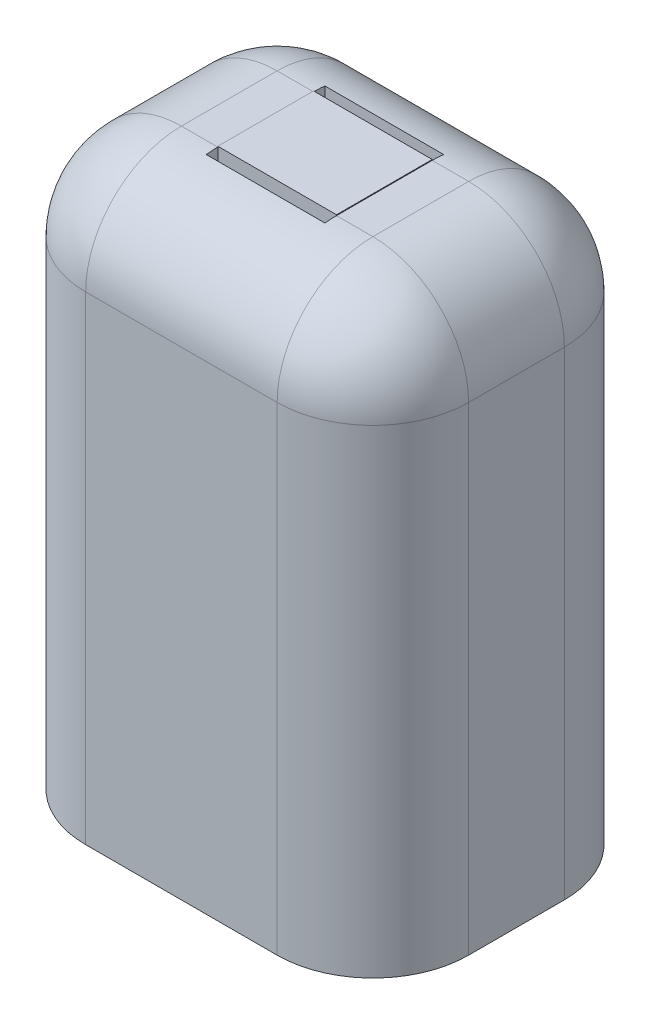
ISO-10303-21;
HEADER;
FILE_DESCRIPTION(('STEP AP214'),'2;1');
FILE_NAME('part.step','',(''),(''),'','','');
FILE_SCHEMA(('AUTOMOTIVE_DESIGN { 1 0 10303 214 1 1 1 1 }'));
ENDSEC;
DATA;
#1=APPLICATION_CONTEXT('core data for automotive mechanical design processes');
#2=APPLICATION_PROTOCOL_DEFINITION('international standard','automotive_design',2000,#1);
#3=PRODUCT_CONTEXT('',#1,'mechanical');
#4=PRODUCT('Part','Part','',(#3));
#5=PRODUCT_RELATED_PRODUCT_CATEGORY('part','',(#4));
#6=PRODUCT_DEFINITION_FORMATION('','',#4);
#7=PRODUCT_DEFINITION_CONTEXT('part definition',#1,'design');
#8=PRODUCT_DEFINITION('design','',#6,#7);
#9=PRODUCT_DEFINITION_SHAPE('','',#8);
#10=(LENGTH_UNIT() NAMED_UNIT(*) SI_UNIT(.MILLI.,.METRE.));
#11=(NAMED_UNIT(*) PLANE_ANGLE_UNIT() SI_UNIT($,.RADIAN.));
#12=(NAMED_UNIT(*) SI_UNIT($,.STERADIAN.) SOLID_ANGLE_UNIT());
#13=UNCERTAINTY_MEASURE_WITH_UNIT(LENGTH_MEASURE(1.E-05),#10,'distance_accuracy_value','');
#14=(GEOMETRIC_REPRESENTATION_CONTEXT(3) GLOBAL_UNCERTAINTY_ASSIGNED_CONTEXT((#13)) GLOBAL_UNIT_ASSIGNED_CONTEXT((#10,
#11,#12)) REPRESENTATION_CONTEXT('',''));
#15=CARTESIAN_POINT('',(0.,0.,0.));
#16=DIRECTION('',(0.,0.,1.));
#17=DIRECTION('',(1.,0.,0.));
#18=AXIS2_PLACEMENT_3D('',#15,#16,#17);
#19=CARTESIAN_POINT('',(-33.1654955272789,108.658164147272,4.4));
#20=DIRECTION('',(1.,0.,0.));
#21=DIRECTION('',(0.,0.,-1.));
#22=AXIS2_PLACEMENT_3D('',#19,#20,#21);
#23=PLANE('',#22);
#24=DIRECTION('',(0.,-1.,0.));
#25=VECTOR('',#24,1.);
#26=CARTESIAN_POINT('',(-33.1654955272789,135.449726458498,10.));
#27=LINE('',#26,#25);
#28=CARTESIAN_POINT('',(-33.1654955272789,135.408164147272,10.));
#29=VERTEX_POINT('',#28);
#30=CARTESIAN_POINT('',(-33.1654955272789,134.449726458498,10.));
#31=VERTEX_POINT('',#30);
#32=EDGE_CURVE('E50',#29,#31,#27,.T.);
#33=ORIENTED_EDGE('',*,*,#32,.T.);
#34=DIRECTION('',(0.,0.,-1.));
#35=VECTOR('',#34,1.);
#36=CARTESIAN_POINT('',(-33.1654955272789,134.449726458498,10.));
#37=LINE('',#36,#35);
#38=CARTESIAN_POINT('',(-33.1654955272789,134.449726458498,5.));
#39=VERTEX_POINT('',#38);
#40=EDGE_CURVE('E169',#31,#39,#37,.T.);
#41=ORIENTED_EDGE('',*,*,#40,.T.);
#42=DIRECTION('',(0.,1.,0.));
#43=VECTOR('',#42,1.);
#44=CARTESIAN_POINT('',(-33.1654955272789,135.449726458498,5.));
#45=LINE('',#44,#43);
#46=CARTESIAN_POINT('',(-33.1654955272789,135.408164147272,5.));
#47=VERTEX_POINT('',#46);
#48=EDGE_CURVE('E173',#39,#47,#45,.T.);
#49=ORIENTED_EDGE('',*,*,#48,.T.);
#50=CARTESIAN_POINT('',(-33.1654955272789,130.408164147272,5.));
#51=DIRECTION('',(1.,0.,0.));
#52=DIRECTION('',(0.,0.,-1.));
#53=AXIS2_PLACEMENT_3D('',#50,#51,#52);
#54=CIRCLE('',#53,5.);
#55=CARTESIAN_POINT('',(-33.1654955272789,135.372033605669,4.4));
#56=VERTEX_POINT('',#55);
#57=EDGE_CURVE('E339',#47,#56,#54,.F.);
#58=ORIENTED_EDGE('',*,*,#57,.T.);
#59=DIRECTION('',(0.,-1.,0.));
#60=VECTOR('',#59,1.);
#61=CARTESIAN_POINT('',(-33.1654955272789,108.658164147272,4.4));
#62=LINE('',#61,#60);
#63=CARTESIAN_POINT('',(-33.1654955272789,105.408164147272,4.4));
#64=VERTEX_POINT('',#63);
#65=EDGE_CURVE('E238',#56,#64,#62,.T.);
#66=ORIENTED_EDGE('',*,*,#65,.T.);
#67=DIRECTION('',(0.,0.,1.));
#68=VECTOR('',#67,1.);
#69=CARTESIAN_POINT('',(-33.1654955272789,105.408164147272,4.4));
#70=LINE('',#69,#68);
#71=CARTESIAN_POINT('',(-33.1654955272789,105.408164147272,10.6));
#72=VERTEX_POINT('',#71);
#73=EDGE_CURVE('E225',#64,#72,#70,.T.);
#74=ORIENTED_EDGE('',*,*,#73,.T.);
#75=DIRECTION('',(0.,-1.,0.));
#76=VECTOR('',#75,1.);
#77=CARTESIAN_POINT('',(-33.1654955272789,108.658164147272,10.6));
#78=LINE('',#77,#76);
#79=CARTESIAN_POINT('',(-33.1654955272789,135.372033605669,10.6));
#80=VERTEX_POINT('',#79);
#81=EDGE_CURVE('E237',#80,#72,#78,.T.);
#82=ORIENTED_EDGE('',*,*,#81,.F.);
#83=CARTESIAN_POINT('',(-33.1654955272789,130.408164147272,10.));
#84=DIRECTION('',(1.,0.,0.));
#85=DIRECTION('',(0.,0.,-1.));
#86=AXIS2_PLACEMENT_3D('',#83,#84,#85);
#87=CIRCLE('',#86,5.);
#88=EDGE_CURVE('E216',#80,#29,#87,.F.);
#89=ORIENTED_EDGE('',*,*,#88,.T.);
#90=EDGE_LOOP('',(#33,#41,#49,#58,#66,#74,#82,#89));
#91=FACE_BOUND('',#90,.T.);
#92=ADVANCED_FACE('F35',(#91),#23,.F.);
#93=CARTESIAN_POINT('',(-39.3654955272789,108.658164147272,4.4));
#94=DIRECTION('',(-1.,0.,0.));
#95=DIRECTION('',(0.,0.,1.));
#96=AXIS2_PLACEMENT_3D('',#93,#94,#95);
#97=PLANE('',#96);
#98=DIRECTION('',(0.,-1.,0.));
#99=VECTOR('',#98,1.);
#100=CARTESIAN_POINT('',(-39.3654955272789,135.449726458498,10.));
#101=LINE('',#100,#99);
#102=CARTESIAN_POINT('',(-39.3654955272789,135.408164147272,10.));
#103=VERTEX_POINT('',#102);
#104=CARTESIAN_POINT('',(-39.3654955272789,134.449726458498,10.));
#105=VERTEX_POINT('',#104);
#106=EDGE_CURVE('E201',#103,#105,#101,.T.);
#107=ORIENTED_EDGE('',*,*,#106,.F.);
#108=CARTESIAN_POINT('',(-39.3654955272789,130.408164147272,10.));
#109=DIRECTION('',(-1.,0.,0.));
#110=DIRECTION('',(0.,0.,1.));
#111=AXIS2_PLACEMENT_3D('',#108,#109,#110);
#112=CIRCLE('',#111,5.);
#113=CARTESIAN_POINT('',(-39.3654955272789,135.372033605669,10.6));
#114=VERTEX_POINT('',#113);
#115=EDGE_CURVE('E221',#103,#114,#112,.F.);
#116=ORIENTED_EDGE('',*,*,#115,.T.);
#117=DIRECTION('',(0.,-1.,0.));
#118=VECTOR('',#117,1.);
#119=CARTESIAN_POINT('',(-39.3654955272789,108.658164147272,10.6));
#120=LINE('',#119,#118);
#121=CARTESIAN_POINT('',(-39.3654955272789,105.408164147272,10.6));
#122=VERTEX_POINT('',#121);
#123=EDGE_CURVE('E243',#114,#122,#120,.T.);
#124=ORIENTED_EDGE('',*,*,#123,.T.);
#125=DIRECTION('',(0.,0.,-1.));
#126=VECTOR('',#125,1.);
#127=CARTESIAN_POINT('',(-39.3654955272789,105.408164147272,4.4));
#128=LINE('',#127,#126);
#129=CARTESIAN_POINT('',(-39.3654955272789,105.408164147272,4.4));
#130=VERTEX_POINT('',#129);
#131=EDGE_CURVE('E231',#122,#130,#128,.T.);
#132=ORIENTED_EDGE('',*,*,#131,.T.);
#133=DIRECTION('',(0.,-1.,0.));
#134=VECTOR('',#133,1.);
#135=CARTESIAN_POINT('',(-39.3654955272789,108.658164147272,4.4));
#136=LINE('',#135,#134);
#137=CARTESIAN_POINT('',(-39.3654955272789,135.372033605669,4.4));
#138=VERTEX_POINT('',#137);
#139=EDGE_CURVE('E241',#138,#130,#136,.T.);
#140=ORIENTED_EDGE('',*,*,#139,.F.);
#141=CARTESIAN_POINT('',(-39.3654955272789,130.408164147272,5.));
#142=DIRECTION('',(-1.,0.,0.));
#143=DIRECTION('',(0.,0.,1.));
#144=AXIS2_PLACEMENT_3D('',#141,#142,#143);
#145=CIRCLE('',#144,5.);
#146=CARTESIAN_POINT('',(-39.3654955272789,135.408164147272,5.));
#147=VERTEX_POINT('',#146);
#148=EDGE_CURVE('E43',#138,#147,#145,.F.);
#149=ORIENTED_EDGE('',*,*,#148,.T.);
#150=DIRECTION('',(0.,1.,0.));
#151=VECTOR('',#150,1.);
#152=CARTESIAN_POINT('',(-39.3654955272789,135.449726458498,5.));
#153=LINE('',#152,#151);
#154=CARTESIAN_POINT('',(-39.3654955272789,134.449726458498,5.));
#155=VERTEX_POINT('',#154);
#156=EDGE_CURVE('E204',#155,#147,#153,.T.);
#157=ORIENTED_EDGE('',*,*,#156,.F.);
#158=DIRECTION('',(0.,0.,-1.));
#159=VECTOR('',#158,1.);
#160=CARTESIAN_POINT('',(-39.3654955272789,134.449726458498,10.));
#161=LINE('',#160,#159);
#162=EDGE_CURVE('E58',#105,#155,#161,.T.);
#163=ORIENTED_EDGE('',*,*,#162,.F.);
#164=EDGE_LOOP('',(#107,#116,#124,#132,#140,#149,#157,#163));
#165=FACE_BOUND('',#164,.T.);
#166=ADVANCED_FACE('F343',(#165),#97,.F.);
#167=CARTESIAN_POINT('',(-46.2654955272789,135.408164147272,15.));
#168=DIRECTION('',(0.,-1.,0.));
#169=DIRECTION('',(0.,0.,-1.));
#170=AXIS2_PLACEMENT_3D('',#167,#168,#169);
#171=PLANE('',#170);
#172=DIRECTION('',(-1.,0.,0.));
#173=VECTOR('',#172,1.);
#174=CARTESIAN_POINT('',(-26.2654955272789,135.408164147272,10.));
#175=LINE('',#174,#173);
#176=CARTESIAN_POINT('',(-41.2654955272789,135.408164147272,10.));
#177=VERTEX_POINT('',#176);
#178=EDGE_CURVE('E265',#177,#103,#175,.F.);
#179=ORIENTED_EDGE('',*,*,#178,.T.);
#180=DIRECTION('',(0.,0.,-1.));
#181=VECTOR('',#180,1.);
#182=CARTESIAN_POINT('',(-39.3654955272789,135.408164147272,15.));
#183=LINE('',#182,#181);
#184=EDGE_CURVE('E218',#103,#147,#183,.T.);
#185=ORIENTED_EDGE('',*,*,#184,.T.);
#186=DIRECTION('',(-1.,0.,0.));
#187=VECTOR('',#186,1.);
#188=CARTESIAN_POINT('',(-46.2654955272789,135.408164147272,5.));
#189=LINE('',#188,#187);
#190=CARTESIAN_POINT('',(-41.2654955272789,135.408164147272,5.));
#191=VERTEX_POINT('',#190);
#192=EDGE_CURVE('E258',#147,#191,#189,.T.);
#193=ORIENTED_EDGE('',*,*,#192,.T.);
#194=DIRECTION('',(0.,0.,-1.));
#195=VECTOR('',#194,1.);
#196=CARTESIAN_POINT('',(-41.2654955272789,135.408164147272,15.));
#197=LINE('',#196,#195);
#198=EDGE_CURVE('E262',#191,#177,#197,.F.);
#199=ORIENTED_EDGE('',*,*,#198,.T.);
#200=EDGE_LOOP('',(#179,#185,#193,#199));
#201=FACE_BOUND('',#200,.T.);
#202=ADVANCED_FACE('F376',(#201),#171,.F.);
#203=CARTESIAN_POINT('',(-26.2654955272789,135.408164147272,15.));
#204=DIRECTION('',(-1.,0.,0.));
#205=DIRECTION('',(0.,-1.,0.));
#206=AXIS2_PLACEMENT_3D('',#203,#204,#205);
#207=PLANE('',#206);
#208=DIRECTION('',(0.,0.,-1.));
#209=VECTOR('',#208,1.);
#210=CARTESIAN_POINT('',(-26.2654955272789,105.408164147272,15.));
#211=LINE('',#210,#209);
#212=CARTESIAN_POINT('',(-26.2654955272789,105.408164147272,10.));
#213=VERTEX_POINT('',#212);
#214=CARTESIAN_POINT('',(-26.2654955272789,105.408164147272,5.));
#215=VERTEX_POINT('',#214);
#216=EDGE_CURVE('E250',#213,#215,#211,.T.);
#217=ORIENTED_EDGE('',*,*,#216,.T.);
#218=DIRECTION('',(0.,1.,0.));
#219=VECTOR('',#218,1.);
#220=CARTESIAN_POINT('',(-26.2654955272789,135.408164147272,5.));
#221=LINE('',#220,#219);
#222=CARTESIAN_POINT('',(-26.2654955272789,130.408164147272,5.));
#223=VERTEX_POINT('',#222);
#224=EDGE_CURVE('E276',#215,#223,#221,.T.);
#225=ORIENTED_EDGE('',*,*,#224,.T.);
#226=DIRECTION('',(0.,0.,-1.));
#227=VECTOR('',#226,1.);
#228=CARTESIAN_POINT('',(-26.2654955272789,130.408164147272,15.));
#229=LINE('',#228,#227);
#230=CARTESIAN_POINT('',(-26.2654955272789,130.408164147272,10.));
#231=VERTEX_POINT('',#230);
#232=EDGE_CURVE('E273',#223,#231,#229,.F.);
#233=ORIENTED_EDGE('',*,*,#232,.T.);
#234=DIRECTION('',(0.,1.,0.));
#235=VECTOR('',#234,1.);
#236=CARTESIAN_POINT('',(-26.2654955272789,105.408164147272,10.));
#237=LINE('',#236,#235);
#238=EDGE_CURVE('E271',#231,#213,#237,.F.);
#239=ORIENTED_EDGE('',*,*,#238,.T.);
#240=EDGE_LOOP('',(#217,#225,#233,#239));
#241=FACE_BOUND('',#240,.T.);
#242=ADVANCED_FACE('F449',(#241),#207,.F.);
#243=CARTESIAN_POINT('',(-31.2654955272789,135.408164147272,5.));
#244=VERTEX_POINT('',#243);
#245=EDGE_CURVE('E259',#244,#47,#189,.T.);
#246=ORIENTED_EDGE('',*,*,#245,.T.);
#247=DIRECTION('',(0.,0.,1.));
#248=VECTOR('',#247,1.);
#249=CARTESIAN_POINT('',(-33.1654955272789,135.408164147272,15.));
#250=LINE('',#249,#248);
#251=EDGE_CURVE('E213',#47,#29,#250,.T.);
#252=ORIENTED_EDGE('',*,*,#251,.T.);
#253=CARTESIAN_POINT('',(-31.2654955272789,135.408164147272,10.));
#254=VERTEX_POINT('',#253);
#255=EDGE_CURVE('E264',#29,#254,#175,.F.);
#256=ORIENTED_EDGE('',*,*,#255,.T.);
#257=DIRECTION('',(0.,0.,-1.));
#258=VECTOR('',#257,1.);
#259=CARTESIAN_POINT('',(-31.2654955272789,135.408164147272,15.));
#260=LINE('',#259,#258);
#261=EDGE_CURVE('E268',#254,#244,#260,.T.);
#262=ORIENTED_EDGE('',*,*,#261,.T.);
#263=EDGE_LOOP('',(#246,#252,#256,#262));
#264=FACE_BOUND('',#263,.T.);
#265=ADVANCED_FACE('F362',(#264),#171,.F.);
#266=CARTESIAN_POINT('',(-46.2654955272789,135.408164147272,15.));
#267=DIRECTION('',(1.,0.,0.));
#268=DIRECTION('',(0.,0.,-1.));
#269=AXIS2_PLACEMENT_3D('',#266,#267,#268);
#270=PLANE('',#269);
#271=DIRECTION('',(0.,0.,-1.));
#272=VECTOR('',#271,1.);
#273=CARTESIAN_POINT('',(-46.2654955272789,130.408164147272,15.));
#274=LINE('',#273,#272);
#275=CARTESIAN_POINT('',(-46.2654955272789,130.408164147272,10.));
#276=VERTEX_POINT('',#275);
#277=CARTESIAN_POINT('',(-46.2654955272789,130.408164147272,5.));
#278=VERTEX_POINT('',#277);
#279=EDGE_CURVE('E286',#276,#278,#274,.T.);
#280=ORIENTED_EDGE('',*,*,#279,.T.);
#281=DIRECTION('',(0.,-1.,0.));
#282=VECTOR('',#281,1.);
#283=CARTESIAN_POINT('',(-46.2654955272789,135.408164147272,5.));
#284=LINE('',#283,#282);
#285=CARTESIAN_POINT('',(-46.2654955272789,105.408164147272,5.));
#286=VERTEX_POINT('',#285);
#287=EDGE_CURVE('E288',#278,#286,#284,.T.);
#288=ORIENTED_EDGE('',*,*,#287,.T.);
#289=DIRECTION('',(0.,0.,-1.));
#290=VECTOR('',#289,1.);
#291=CARTESIAN_POINT('',(-46.2654955272789,105.408164147272,15.));
#292=LINE('',#291,#290);
#293=CARTESIAN_POINT('',(-46.2654955272789,105.408164147272,10.));
#294=VERTEX_POINT('',#293);
#295=EDGE_CURVE('E255',#294,#286,#292,.T.);
#296=ORIENTED_EDGE('',*,*,#295,.F.);
#297=DIRECTION('',(0.,-1.,0.));
#298=VECTOR('',#297,1.);
#299=CARTESIAN_POINT('',(-46.2654955272789,135.408164147272,10.));
#300=LINE('',#299,#298);
#301=EDGE_CURVE('E284',#294,#276,#300,.F.);
#302=ORIENTED_EDGE('',*,*,#301,.T.);
#303=EDGE_LOOP('',(#280,#288,#296,#302));
#304=FACE_BOUND('',#303,.T.);
#305=ADVANCED_FACE('F443',(#304),#270,.F.);
#306=CARTESIAN_POINT('',(-46.2654955272789,105.408164147272,15.));
#307=DIRECTION('',(0.,1.,0.));
#308=DIRECTION('',(0.,0.,1.));
#309=AXIS2_PLACEMENT_3D('',#306,#307,#308);
#310=PLANE('',#309);
#311=DIRECTION('',(-1.,0.,0.));
#312=VECTOR('',#311,1.);
#313=CARTESIAN_POINT('',(-39.3654955272789,105.408164147272,10.6));
#314=LINE('',#313,#312);
#315=EDGE_CURVE('E227',#72,#122,#314,.T.);
#316=ORIENTED_EDGE('',*,*,#315,.F.);
#317=ORIENTED_EDGE('',*,*,#73,.F.);
#318=DIRECTION('',(1.,0.,0.));
#319=VECTOR('',#318,1.);
#320=CARTESIAN_POINT('',(-39.3654955272789,105.408164147272,4.4));
#321=LINE('',#320,#319);
#322=EDGE_CURVE('E234',#130,#64,#321,.T.);
#323=ORIENTED_EDGE('',*,*,#322,.F.);
#324=ORIENTED_EDGE('',*,*,#131,.F.);
#325=EDGE_LOOP('',(#316,#317,#323,#324));
#326=FACE_BOUND('',#325,.T.);
#327=ORIENTED_EDGE('',*,*,#295,.T.);
#328=CARTESIAN_POINT('',(-41.2654955272789,105.408164147272,5.));
#329=DIRECTION('',(0.,1.,0.));
#330=DIRECTION('',(0.,0.,1.));
#331=AXIS2_PLACEMENT_3D('',#328,#329,#330);
#332=CIRCLE('',#331,5.);
#333=CARTESIAN_POINT('',(-41.2654955272789,105.408164147272,0.));
#334=VERTEX_POINT('',#333);
#335=EDGE_CURVE('E302',#286,#334,#332,.F.);
#336=ORIENTED_EDGE('',*,*,#335,.T.);
#337=DIRECTION('',(1.,0.,0.));
#338=VECTOR('',#337,1.);
#339=CARTESIAN_POINT('',(-46.2654955272789,105.408164147272,0.));
#340=LINE('',#339,#338);
#341=CARTESIAN_POINT('',(-31.2654955272789,105.408164147272,0.));
#342=VERTEX_POINT('',#341);
#343=EDGE_CURVE('E240',#334,#342,#340,.T.);
#344=ORIENTED_EDGE('',*,*,#343,.T.);
#345=CARTESIAN_POINT('',(-31.2654955272789,105.408164147272,5.));
#346=DIRECTION('',(0.,1.,0.));
#347=DIRECTION('',(0.,0.,1.));
#348=AXIS2_PLACEMENT_3D('',#345,#346,#347);
#349=CIRCLE('',#348,5.);
#350=EDGE_CURVE('E298',#342,#215,#349,.F.);
#351=ORIENTED_EDGE('',*,*,#350,.T.);
#352=ORIENTED_EDGE('',*,*,#216,.F.);
#353=CARTESIAN_POINT('',(-31.2654955272789,105.408164147272,10.));
#354=DIRECTION('',(0.,1.,0.));
#355=DIRECTION('',(0.,0.,1.));
#356=AXIS2_PLACEMENT_3D('',#353,#354,#355);
#357=CIRCLE('',#356,5.);
#358=CARTESIAN_POINT('',(-31.2654955272789,105.408164147272,15.));
#359=VERTEX_POINT('',#358);
#360=EDGE_CURVE('E296',#213,#359,#357,.F.);
#361=ORIENTED_EDGE('',*,*,#360,.T.);
#362=DIRECTION('',(1.,0.,0.));
#363=VECTOR('',#362,1.);
#364=CARTESIAN_POINT('',(-46.2654955272789,105.408164147272,15.));
#365=LINE('',#364,#363);
#366=CARTESIAN_POINT('',(-41.2654955272789,105.408164147272,15.));
#367=VERTEX_POINT('',#366);
#368=EDGE_CURVE('E247',#367,#359,#365,.T.);
#369=ORIENTED_EDGE('',*,*,#368,.F.);
#370=CARTESIAN_POINT('',(-41.2654955272789,105.408164147272,10.));
#371=DIRECTION('',(0.,1.,0.));
#372=DIRECTION('',(0.,0.,1.));
#373=AXIS2_PLACEMENT_3D('',#370,#371,#372);
#374=CIRCLE('',#373,5.);
#375=EDGE_CURVE('E300',#367,#294,#374,.F.);
#376=ORIENTED_EDGE('',*,*,#375,.T.);
#377=EDGE_LOOP('',(#327,#336,#344,#351,#352,#361,#369,#376));
#378=FACE_BOUND('',#377,.T.);
#379=ADVANCED_FACE('F415',(#326,#378),#310,.F.);
#380=CARTESIAN_POINT('',(0.,0.,15.));
#381=DIRECTION('',(0.,0.,1.));
#382=DIRECTION('',(1.,0.,0.));
#383=AXIS2_PLACEMENT_3D('',#380,#381,#382);
#384=PLANE('',#383);
#385=DIRECTION('',(-1.,0.,0.));
#386=VECTOR('',#385,1.);
#387=CARTESIAN_POINT('',(-46.2654955272789,130.408164147272,15.));
#388=LINE('',#387,#386);
#389=CARTESIAN_POINT('',(-31.2654955272789,130.408164147272,15.));
#390=VERTEX_POINT('',#389);
#391=CARTESIAN_POINT('',(-41.2654955272789,130.408164147272,15.));
#392=VERTEX_POINT('',#391);
#393=EDGE_CURVE('E280',#390,#392,#388,.T.);
#394=ORIENTED_EDGE('',*,*,#393,.T.);
#395=DIRECTION('',(0.,-1.,0.));
#396=VECTOR('',#395,1.);
#397=CARTESIAN_POINT('',(-41.2654955272789,105.408164147272,15.));
#398=LINE('',#397,#396);
#399=EDGE_CURVE('E282',#392,#367,#398,.T.);
#400=ORIENTED_EDGE('',*,*,#399,.T.);
#401=ORIENTED_EDGE('',*,*,#368,.T.);
#402=DIRECTION('',(0.,1.,0.));
#403=VECTOR('',#402,1.);
#404=CARTESIAN_POINT('',(-31.2654955272789,135.408164147272,15.));
#405=LINE('',#404,#403);
#406=EDGE_CURVE('E278',#359,#390,#405,.T.);
#407=ORIENTED_EDGE('',*,*,#406,.T.);
#408=EDGE_LOOP('',(#394,#400,#401,#407));
#409=FACE_BOUND('',#408,.T.);
#410=ADVANCED_FACE('F435',(#409),#384,.T.);
#411=CARTESIAN_POINT('',(0.,0.,0.));
#412=DIRECTION('',(0.,0.,1.));
#413=DIRECTION('',(1.,0.,0.));
#414=AXIS2_PLACEMENT_3D('',#411,#412,#413);
#415=PLANE('',#414);
#416=ORIENTED_EDGE('',*,*,#343,.F.);
#417=DIRECTION('',(0.,-1.,0.));
#418=VECTOR('',#417,1.);
#419=CARTESIAN_POINT('',(-41.2654955272789,0.,0.));
#420=LINE('',#419,#418);
#421=CARTESIAN_POINT('',(-41.2654955272789,130.408164147272,0.));
#422=VERTEX_POINT('',#421);
#423=EDGE_CURVE('E294',#334,#422,#420,.F.);
#424=ORIENTED_EDGE('',*,*,#423,.T.);
#425=DIRECTION('',(-1.,0.,0.));
#426=VECTOR('',#425,1.);
#427=CARTESIAN_POINT('',(0.,130.408164147272,0.));
#428=LINE('',#427,#426);
#429=CARTESIAN_POINT('',(-31.2654955272789,130.408164147272,0.));
#430=VERTEX_POINT('',#429);
#431=EDGE_CURVE('E292',#422,#430,#428,.F.);
#432=ORIENTED_EDGE('',*,*,#431,.T.);
#433=DIRECTION('',(0.,1.,0.));
#434=VECTOR('',#433,1.);
#435=CARTESIAN_POINT('',(-31.2654955272788,0.,0.));
#436=LINE('',#435,#434);
#437=EDGE_CURVE('E290',#430,#342,#436,.F.);
#438=ORIENTED_EDGE('',*,*,#437,.T.);
#439=EDGE_LOOP('',(#416,#424,#432,#438));
#440=FACE_BOUND('',#439,.T.);
#441=ADVANCED_FACE('F426',(#440),#415,.F.);
#442=CARTESIAN_POINT('',(-39.3654955272789,108.658164147272,4.4));
#443=DIRECTION('',(0.,0.,-1.));
#444=DIRECTION('',(-1.,0.,0.));
#445=AXIS2_PLACEMENT_3D('',#442,#443,#444);
#446=PLANE('',#445);
#447=ORIENTED_EDGE('',*,*,#322,.T.);
#448=ORIENTED_EDGE('',*,*,#65,.F.);
#449=DIRECTION('',(-1.,0.,0.));
#450=VECTOR('',#449,1.);
#451=CARTESIAN_POINT('',(-46.2654955272789,135.372033605669,4.4));
#452=LINE('',#451,#450);
#453=EDGE_CURVE('E304',#56,#138,#452,.T.);
#454=ORIENTED_EDGE('',*,*,#453,.T.);
#455=ORIENTED_EDGE('',*,*,#139,.T.);
#456=EDGE_LOOP('',(#447,#448,#454,#455));
#457=FACE_BOUND('',#456,.T.);
#458=ADVANCED_FACE('F411',(#457),#446,.F.);
#459=CARTESIAN_POINT('',(-39.3654955272789,108.658164147272,10.6));
#460=DIRECTION('',(0.,0.,1.));
#461=DIRECTION('',(1.,0.,0.));
#462=AXIS2_PLACEMENT_3D('',#459,#460,#461);
#463=PLANE('',#462);
#464=ORIENTED_EDGE('',*,*,#315,.T.);
#465=ORIENTED_EDGE('',*,*,#123,.F.);
#466=DIRECTION('',(1.,0.,0.));
#467=VECTOR('',#466,1.);
#468=CARTESIAN_POINT('',(0.,135.372033605669,10.6));
#469=LINE('',#468,#467);
#470=EDGE_CURVE('E11',#114,#80,#469,.T.);
#471=ORIENTED_EDGE('',*,*,#470,.T.);
#472=ORIENTED_EDGE('',*,*,#81,.T.);
#473=EDGE_LOOP('',(#464,#465,#471,#472));
#474=FACE_BOUND('',#473,.T.);
#475=ADVANCED_FACE('F418',(#474),#463,.F.);
#476=CARTESIAN_POINT('',(-41.2654955272789,0.,10.));
#477=DIRECTION('',(0.,1.,0.));
#478=DIRECTION('',(0.,0.,1.));
#479=AXIS2_PLACEMENT_3D('',#476,#477,#478);
#480=CYLINDRICAL_SURFACE('',#479,5.);
#481=ORIENTED_EDGE('',*,*,#375,.F.);
#482=ORIENTED_EDGE('',*,*,#399,.F.);
#483=CARTESIAN_POINT('',(-41.2654955272789,130.408164147272,10.));
#484=DIRECTION('',(0.,1.,0.));
#485=DIRECTION('',(0.,0.,1.));
#486=AXIS2_PLACEMENT_3D('',#483,#484,#485);
#487=CIRCLE('',#486,5.);
#488=EDGE_CURVE('E228',#276,#392,#487,.T.);
#489=ORIENTED_EDGE('',*,*,#488,.F.);
#490=ORIENTED_EDGE('',*,*,#301,.F.);
#491=EDGE_LOOP('',(#481,#482,#489,#490));
#492=FACE_BOUND('',#491,.T.);
#493=ADVANCED_FACE('F37',(#492),#480,.T.);
#494=CARTESIAN_POINT('',(-41.2654955272789,130.408164147272,15.));
#495=DIRECTION('',(0.,0.,-1.));
#496=DIRECTION('',(-1.,0.,0.));
#497=AXIS2_PLACEMENT_3D('',#494,#495,#496);
#498=CYLINDRICAL_SURFACE('',#497,5.);
#499=CARTESIAN_POINT('',(-41.2654955272789,130.408164147272,5.));
#500=DIRECTION('',(0.,0.,-1.));
#501=DIRECTION('',(-1.,0.,0.));
#502=AXIS2_PLACEMENT_3D('',#499,#500,#501);
#503=CIRCLE('',#502,5.);
#504=EDGE_CURVE('E329',#278,#191,#503,.T.);
#505=ORIENTED_EDGE('',*,*,#504,.F.);
#506=ORIENTED_EDGE('',*,*,#279,.F.);
#507=CARTESIAN_POINT('',(-41.2654955272789,130.408164147272,10.));
#508=DIRECTION('',(0.,0.,1.));
#509=DIRECTION('',(1.,0.,0.));
#510=AXIS2_PLACEMENT_3D('',#507,#508,#509);
#511=CIRCLE('',#510,5.);
#512=EDGE_CURVE('E332',#177,#276,#511,.T.);
#513=ORIENTED_EDGE('',*,*,#512,.F.);
#514=ORIENTED_EDGE('',*,*,#198,.F.);
#515=EDGE_LOOP('',(#505,#506,#513,#514));
#516=FACE_BOUND('',#515,.T.);
#517=ADVANCED_FACE('F383',(#516),#498,.T.);
#518=CARTESIAN_POINT('',(-41.2654955272789,135.408164147272,5.));
#519=DIRECTION('',(0.,-1.,0.));
#520=DIRECTION('',(0.,0.,-1.));
#521=AXIS2_PLACEMENT_3D('',#518,#519,#520);
#522=CYLINDRICAL_SURFACE('',#521,5.);
#523=ORIENTED_EDGE('',*,*,#335,.F.);
#524=ORIENTED_EDGE('',*,*,#287,.F.);
#525=CARTESIAN_POINT('',(-41.2654955272789,130.408164147272,5.));
#526=DIRECTION('',(0.,1.,0.));
#527=DIRECTION('',(0.,0.,1.));
#528=AXIS2_PLACEMENT_3D('',#525,#526,#527);
#529=CIRCLE('',#528,5.);
#530=EDGE_CURVE('E326',#422,#278,#529,.T.);
#531=ORIENTED_EDGE('',*,*,#530,.F.);
#532=ORIENTED_EDGE('',*,*,#423,.F.);
#533=EDGE_LOOP('',(#523,#524,#531,#532));
#534=FACE_BOUND('',#533,.T.);
#535=ADVANCED_FACE('F475',(#534),#522,.T.);
#536=CARTESIAN_POINT('',(-41.2654955272789,130.408164147272,10.));
#537=DIRECTION('',(0.,0.,1.));
#538=DIRECTION('',(1.,0.,0.));
#539=AXIS2_PLACEMENT_3D('',#536,#537,#538);
#540=SPHERICAL_SURFACE('',#539,5.);
#541=ORIENTED_EDGE('',*,*,#512,.T.);
#542=ORIENTED_EDGE('',*,*,#488,.T.);
#543=CARTESIAN_POINT('',(-41.2654955272789,130.408164147272,10.));
#544=DIRECTION('',(-1.,0.,0.));
#545=DIRECTION('',(0.,0.,1.));
#546=AXIS2_PLACEMENT_3D('',#543,#544,#545);
#547=CIRCLE('',#546,5.);
#548=EDGE_CURVE('E323',#177,#392,#547,.F.);
#549=ORIENTED_EDGE('',*,*,#548,.F.);
#550=EDGE_LOOP('',(#541,#542,#549));
#551=FACE_BOUND('',#550,.T.);
#552=ADVANCED_FACE('F386',(#551),#540,.T.);
#553=CARTESIAN_POINT('',(-41.2654955272789,130.408164147272,5.));
#554=DIRECTION('',(0.,0.,1.));
#555=DIRECTION('',(1.,0.,0.));
#556=AXIS2_PLACEMENT_3D('',#553,#554,#555);
#557=SPHERICAL_SURFACE('',#556,5.);
#558=ORIENTED_EDGE('',*,*,#530,.T.);
#559=ORIENTED_EDGE('',*,*,#504,.T.);
#560=CARTESIAN_POINT('',(-41.2654955272789,130.408164147272,5.));
#561=DIRECTION('',(-1.,0.,0.));
#562=DIRECTION('',(0.,0.,1.));
#563=AXIS2_PLACEMENT_3D('',#560,#561,#562);
#564=CIRCLE('',#563,5.);
#565=EDGE_CURVE('E320',#422,#191,#564,.F.);
#566=ORIENTED_EDGE('',*,*,#565,.F.);
#567=EDGE_LOOP('',(#558,#559,#566));
#568=FACE_BOUND('',#567,.T.);
#569=ADVANCED_FACE('F469',(#568),#557,.T.);
#570=CARTESIAN_POINT('',(-31.2654955272788,0.,10.));
#571=DIRECTION('',(0.,-1.,0.));
#572=DIRECTION('',(1.,0.,0.));
#573=AXIS2_PLACEMENT_3D('',#570,#571,#572);
#574=CYLINDRICAL_SURFACE('',#573,5.);
#575=ORIENTED_EDGE('',*,*,#360,.F.);
#576=ORIENTED_EDGE('',*,*,#238,.F.);
#577=CARTESIAN_POINT('',(-31.2654955272789,130.408164147272,10.));
#578=DIRECTION('',(0.,1.,0.));
#579=DIRECTION('',(0.,0.,1.));
#580=AXIS2_PLACEMENT_3D('',#577,#578,#579);
#581=CIRCLE('',#580,5.);
#582=EDGE_CURVE('E317',#390,#231,#581,.T.);
#583=ORIENTED_EDGE('',*,*,#582,.F.);
#584=ORIENTED_EDGE('',*,*,#406,.F.);
#585=EDGE_LOOP('',(#575,#576,#583,#584));
#586=FACE_BOUND('',#585,.T.);
#587=ADVANCED_FACE('F394',(#586),#574,.T.);
#588=CARTESIAN_POINT('',(0.,130.408164147272,10.));
#589=DIRECTION('',(1.,0.,0.));
#590=DIRECTION('',(0.,0.,-1.));
#591=AXIS2_PLACEMENT_3D('',#588,#589,#590);
#592=CYLINDRICAL_SURFACE('',#591,5.);
#593=ORIENTED_EDGE('',*,*,#115,.F.);
#594=ORIENTED_EDGE('',*,*,#178,.F.);
#595=ORIENTED_EDGE('',*,*,#548,.T.);
#596=ORIENTED_EDGE('',*,*,#393,.F.);
#597=CARTESIAN_POINT('',(-31.2654955272789,130.408164147272,10.));
#598=DIRECTION('',(1.,0.,0.));
#599=DIRECTION('',(0.,0.,-1.));
#600=AXIS2_PLACEMENT_3D('',#597,#598,#599);
#601=CIRCLE('',#600,5.);
#602=EDGE_CURVE('E314',#254,#390,#601,.T.);
#603=ORIENTED_EDGE('',*,*,#602,.F.);
#604=ORIENTED_EDGE('',*,*,#255,.F.);
#605=ORIENTED_EDGE('',*,*,#88,.F.);
#606=ORIENTED_EDGE('',*,*,#470,.F.);
#607=EDGE_LOOP('',(#593,#594,#595,#596,#603,#604,#605,#606));
#608=FACE_BOUND('',#607,.T.);
#609=ADVANCED_FACE('F368',(#608),#592,.T.);
#610=CARTESIAN_POINT('',(-46.2654955272789,130.408164147272,5.));
#611=DIRECTION('',(-1.,0.,0.));
#612=DIRECTION('',(0.,0.,1.));
#613=AXIS2_PLACEMENT_3D('',#610,#611,#612);
#614=CYLINDRICAL_SURFACE('',#613,5.);
#615=ORIENTED_EDGE('',*,*,#148,.F.);
#616=ORIENTED_EDGE('',*,*,#453,.F.);
#617=ORIENTED_EDGE('',*,*,#57,.F.);
#618=ORIENTED_EDGE('',*,*,#245,.F.);
#619=CARTESIAN_POINT('',(-31.2654955272789,130.408164147272,5.));
#620=DIRECTION('',(1.,0.,0.));
#621=DIRECTION('',(0.,0.,-1.));
#622=AXIS2_PLACEMENT_3D('',#619,#620,#621);
#623=CIRCLE('',#622,5.);
#624=EDGE_CURVE('E311',#430,#244,#623,.T.);
#625=ORIENTED_EDGE('',*,*,#624,.F.);
#626=ORIENTED_EDGE('',*,*,#431,.F.);
#627=ORIENTED_EDGE('',*,*,#565,.T.);
#628=ORIENTED_EDGE('',*,*,#192,.F.);
#629=EDGE_LOOP('',(#615,#616,#617,#618,#625,#626,#627,#628));
#630=FACE_BOUND('',#629,.T.);
#631=ADVANCED_FACE('F407',(#630),#614,.T.);
#632=CARTESIAN_POINT('',(-31.2654955272789,135.408164147272,5.));
#633=DIRECTION('',(0.,1.,0.));
#634=DIRECTION('',(-1.,0.,0.));
#635=AXIS2_PLACEMENT_3D('',#632,#633,#634);
#636=CYLINDRICAL_SURFACE('',#635,5.);
#637=ORIENTED_EDGE('',*,*,#350,.F.);
#638=ORIENTED_EDGE('',*,*,#437,.F.);
#639=CARTESIAN_POINT('',(-31.2654955272789,130.408164147272,5.));
#640=DIRECTION('',(0.,1.,0.));
#641=DIRECTION('',(0.,0.,1.));
#642=AXIS2_PLACEMENT_3D('',#639,#640,#641);
#643=CIRCLE('',#642,5.);
#644=EDGE_CURVE('E308',#223,#430,#643,.T.);
#645=ORIENTED_EDGE('',*,*,#644,.F.);
#646=ORIENTED_EDGE('',*,*,#224,.F.);
#647=EDGE_LOOP('',(#637,#638,#645,#646));
#648=FACE_BOUND('',#647,.T.);
#649=ADVANCED_FACE('F459',(#648),#636,.T.);
#650=CARTESIAN_POINT('',(-31.2654955272789,130.408164147272,10.));
#651=DIRECTION('',(0.,0.,1.));
#652=DIRECTION('',(1.,0.,0.));
#653=AXIS2_PLACEMENT_3D('',#650,#651,#652);
#654=SPHERICAL_SURFACE('',#653,5.);
#655=ORIENTED_EDGE('',*,*,#602,.T.);
#656=ORIENTED_EDGE('',*,*,#582,.T.);
#657=CARTESIAN_POINT('',(-31.2654955272789,130.408164147272,10.));
#658=DIRECTION('',(0.,0.,1.));
#659=DIRECTION('',(1.,0.,0.));
#660=AXIS2_PLACEMENT_3D('',#657,#658,#659);
#661=CIRCLE('',#660,5.);
#662=EDGE_CURVE('E306',#254,#231,#661,.F.);
#663=ORIENTED_EDGE('',*,*,#662,.F.);
#664=EDGE_LOOP('',(#655,#656,#663));
#665=FACE_BOUND('',#664,.T.);
#666=ADVANCED_FACE('F396',(#665),#654,.T.);
#667=CARTESIAN_POINT('',(-31.2654955272789,130.408164147272,5.));
#668=DIRECTION('',(0.,0.,1.));
#669=DIRECTION('',(1.,0.,0.));
#670=AXIS2_PLACEMENT_3D('',#667,#668,#669);
#671=SPHERICAL_SURFACE('',#670,5.);
#672=ORIENTED_EDGE('',*,*,#644,.T.);
#673=ORIENTED_EDGE('',*,*,#624,.T.);
#674=CARTESIAN_POINT('',(-31.2654955272789,130.408164147272,5.));
#675=DIRECTION('',(0.,0.,-1.));
#676=DIRECTION('',(-1.,0.,0.));
#677=AXIS2_PLACEMENT_3D('',#674,#675,#676);
#678=CIRCLE('',#677,5.);
#679=EDGE_CURVE('E224',#223,#244,#678,.F.);
#680=ORIENTED_EDGE('',*,*,#679,.F.);
#681=EDGE_LOOP('',(#672,#673,#680));
#682=FACE_BOUND('',#681,.T.);
#683=ADVANCED_FACE('F404',(#682),#671,.T.);
#684=CARTESIAN_POINT('',(-31.2654955272789,130.408164147272,15.));
#685=DIRECTION('',(0.,0.,-1.));
#686=DIRECTION('',(-1.,0.,0.));
#687=AXIS2_PLACEMENT_3D('',#684,#685,#686);
#688=CYLINDRICAL_SURFACE('',#687,5.);
#689=ORIENTED_EDGE('',*,*,#662,.T.);
#690=ORIENTED_EDGE('',*,*,#232,.F.);
#691=ORIENTED_EDGE('',*,*,#679,.T.);
#692=ORIENTED_EDGE('',*,*,#261,.F.);
#693=EDGE_LOOP('',(#689,#690,#691,#692));
#694=FACE_BOUND('',#693,.T.);
#695=ADVANCED_FACE('F400',(#694),#688,.T.);
#696=CARTESIAN_POINT('',(-33.1654955272789,0.,0.));
#697=DIRECTION('',(1.,0.,0.));
#698=DIRECTION('',(0.,0.,-1.));
#699=AXIS2_PLACEMENT_3D('',#696,#697,#698);
#700=PLANE('',#699);
#701=ORIENTED_EDGE('',*,*,#251,.F.);
#702=CARTESIAN_POINT('',(-33.1654955272789,135.449726458498,5.));
#703=VERTEX_POINT('',#702);
#704=EDGE_CURVE('E178',#47,#703,#45,.T.);
#705=ORIENTED_EDGE('',*,*,#704,.T.);
#706=DIRECTION('',(0.,0.,1.));
#707=VECTOR('',#706,1.);
#708=CARTESIAN_POINT('',(-33.1654955272789,135.449726458498,10.));
#709=LINE('',#708,#707);
#710=CARTESIAN_POINT('',(-33.1654955272789,135.449726458498,10.));
#711=VERTEX_POINT('',#710);
#712=EDGE_CURVE('E192',#703,#711,#709,.T.);
#713=ORIENTED_EDGE('',*,*,#712,.T.);
#714=EDGE_CURVE('E179',#711,#29,#27,.T.);
#715=ORIENTED_EDGE('',*,*,#714,.T.);
#716=EDGE_LOOP('',(#701,#705,#713,#715));
#717=FACE_BOUND('',#716,.T.);
#718=ADVANCED_FACE('F359',(#717),#700,.T.);
#719=CARTESIAN_POINT('',(-39.3654955272789,0.,0.));
#720=DIRECTION('',(1.,0.,0.));
#721=DIRECTION('',(0.,0.,-1.));
#722=AXIS2_PLACEMENT_3D('',#719,#720,#721);
#723=PLANE('',#722);
#724=CARTESIAN_POINT('',(-39.3654955272789,135.449726458498,5.));
#725=VERTEX_POINT('',#724);
#726=EDGE_CURVE('E203',#147,#725,#153,.T.);
#727=ORIENTED_EDGE('',*,*,#726,.F.);
#728=ORIENTED_EDGE('',*,*,#184,.F.);
#729=CARTESIAN_POINT('',(-39.3654955272789,135.449726458498,10.));
#730=VERTEX_POINT('',#729);
#731=EDGE_CURVE('E198',#730,#103,#101,.T.);
#732=ORIENTED_EDGE('',*,*,#731,.F.);
#733=DIRECTION('',(0.,0.,1.));
#734=VECTOR('',#733,1.);
#735=CARTESIAN_POINT('',(-39.3654955272789,135.449726458498,10.));
#736=LINE('',#735,#734);
#737=EDGE_CURVE('E206',#725,#730,#736,.T.);
#738=ORIENTED_EDGE('',*,*,#737,.F.);
#739=EDGE_LOOP('',(#727,#728,#732,#738));
#740=FACE_BOUND('',#739,.T.);
#741=ADVANCED_FACE('F349',(#740),#723,.F.);
#742=CARTESIAN_POINT('',(-33.1654955272789,135.449726458498,10.));
#743=DIRECTION('',(0.,0.,-1.));
#744=DIRECTION('',(-1.,0.,0.));
#745=AXIS2_PLACEMENT_3D('',#742,#743,#744);
#746=PLANE('',#745);
#747=ORIENTED_EDGE('',*,*,#731,.T.);
#748=ORIENTED_EDGE('',*,*,#106,.T.);
#749=DIRECTION('',(-1.,0.,0.));
#750=VECTOR('',#749,1.);
#751=CARTESIAN_POINT('',(-33.1654955272789,134.449726458498,10.));
#752=LINE('',#751,#750);
#753=EDGE_CURVE('E186',#31,#105,#752,.T.);
#754=ORIENTED_EDGE('',*,*,#753,.F.);
#755=ORIENTED_EDGE('',*,*,#32,.F.);
#756=ORIENTED_EDGE('',*,*,#714,.F.);
#757=DIRECTION('',(-1.,0.,0.));
#758=VECTOR('',#757,1.);
#759=CARTESIAN_POINT('',(-33.1654955272789,135.449726458498,10.));
#760=LINE('',#759,#758);
#761=EDGE_CURVE('E194',#711,#730,#760,.T.);
#762=ORIENTED_EDGE('',*,*,#761,.T.);
#763=EDGE_LOOP('',(#747,#748,#754,#755,#756,#762));
#764=FACE_BOUND('',#763,.T.);
#765=ADVANCED_FACE('F373',(#764),#746,.F.);
#766=CARTESIAN_POINT('',(-33.1654955272789,134.449726458498,10.));
#767=DIRECTION('',(0.,1.,0.));
#768=DIRECTION('',(0.,0.,1.));
#769=AXIS2_PLACEMENT_3D('',#766,#767,#768);
#770=PLANE('',#769);
#771=ORIENTED_EDGE('',*,*,#162,.T.);
#772=DIRECTION('',(-1.,0.,0.));
#773=VECTOR('',#772,1.);
#774=CARTESIAN_POINT('',(-33.1654955272789,134.449726458498,5.));
#775=LINE('',#774,#773);
#776=EDGE_CURVE('E182',#39,#155,#775,.T.);
#777=ORIENTED_EDGE('',*,*,#776,.F.);
#778=ORIENTED_EDGE('',*,*,#40,.F.);
#779=ORIENTED_EDGE('',*,*,#753,.T.);
#780=EDGE_LOOP('',(#771,#777,#778,#779));
#781=FACE_BOUND('',#780,.T.);
#782=ADVANCED_FACE('F183',(#781),#770,.F.);
#783=CARTESIAN_POINT('',(-33.1654955272789,135.449726458498,5.));
#784=DIRECTION('',(0.,0.,1.));
#785=DIRECTION('',(1.,0.,0.));
#786=AXIS2_PLACEMENT_3D('',#783,#784,#785);
#787=PLANE('',#786);
#788=ORIENTED_EDGE('',*,*,#156,.T.);
#789=ORIENTED_EDGE('',*,*,#726,.T.);
#790=DIRECTION('',(-1.,0.,0.));
#791=VECTOR('',#790,1.);
#792=CARTESIAN_POINT('',(-33.1654955272789,135.449726458498,5.));
#793=LINE('',#792,#791);
#794=EDGE_CURVE('E187',#703,#725,#793,.T.);
#795=ORIENTED_EDGE('',*,*,#794,.F.);
#796=ORIENTED_EDGE('',*,*,#704,.F.);
#797=ORIENTED_EDGE('',*,*,#48,.F.);
#798=ORIENTED_EDGE('',*,*,#776,.T.);
#799=EDGE_LOOP('',(#788,#789,#795,#796,#797,#798));
#800=FACE_BOUND('',#799,.T.);
#801=ADVANCED_FACE('F190',(#800),#787,.F.);
#802=CARTESIAN_POINT('',(-33.1654955272789,135.449726458498,10.));
#803=DIRECTION('',(0.,-1.,0.));
#804=DIRECTION('',(0.,0.,-1.));
#805=AXIS2_PLACEMENT_3D('',#802,#803,#804);
#806=PLANE('',#805);
#807=ORIENTED_EDGE('',*,*,#737,.T.);
#808=ORIENTED_EDGE('',*,*,#761,.F.);
#809=ORIENTED_EDGE('',*,*,#712,.F.);
#810=ORIENTED_EDGE('',*,*,#794,.T.);
#811=EDGE_LOOP('',(#807,#808,#809,#810));
#812=FACE_BOUND('',#811,.T.);
#813=ADVANCED_FACE('F353',(#812),#806,.F.);
#814=CLOSED_SHELL('',(#92,#166,#202,#242,#265,#305,#379,#410,#441,#458,#475,#493,#517,#535,#552,
#569,#587,#609,#631,#649,#666,#683,#695,#718,#741,#765,#782,#801,#813));
#815=MANIFOLD_SOLID_BREP('B2',#814);
#816=ADVANCED_BREP_SHAPE_REPRESENTATION('',(#18,#815),#14);
#817=SHAPE_DEFINITION_REPRESENTATION(#9,#816);
ENDSEC;
END-ISO-10303-21;
